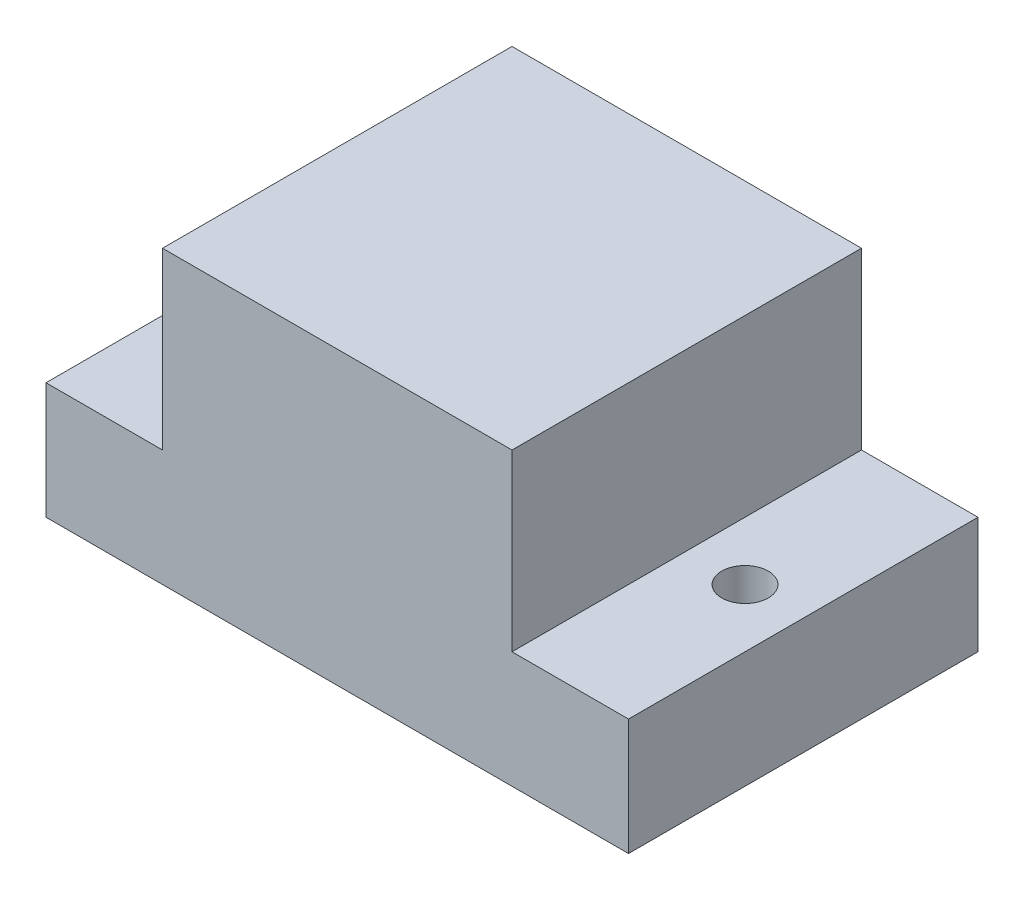
ISO-10303-21;
HEADER;
FILE_DESCRIPTION(('STEP AP214'),'2;1');
FILE_NAME('part.step','',(''),(''),'','','');
FILE_SCHEMA(('AUTOMOTIVE_DESIGN { 1 0 10303 214 1 1 1 1 }'));
ENDSEC;
DATA;
#1=APPLICATION_CONTEXT('core data for automotive mechanical design processes');
#2=APPLICATION_PROTOCOL_DEFINITION('international standard','automotive_design',2000,#1);
#3=PRODUCT_CONTEXT('',#1,'mechanical');
#4=PRODUCT('Part','Part','',(#3));
#5=PRODUCT_RELATED_PRODUCT_CATEGORY('part','',(#4));
#6=PRODUCT_DEFINITION_FORMATION('','',#4);
#7=PRODUCT_DEFINITION_CONTEXT('part definition',#1,'design');
#8=PRODUCT_DEFINITION('design','',#6,#7);
#9=PRODUCT_DEFINITION_SHAPE('','',#8);
#10=(LENGTH_UNIT() NAMED_UNIT(*) SI_UNIT(.MILLI.,.METRE.));
#11=(NAMED_UNIT(*) PLANE_ANGLE_UNIT() SI_UNIT($,.RADIAN.));
#12=(NAMED_UNIT(*) SI_UNIT($,.STERADIAN.) SOLID_ANGLE_UNIT());
#13=UNCERTAINTY_MEASURE_WITH_UNIT(LENGTH_MEASURE(1.E-05),#10,'distance_accuracy_value','');
#14=(GEOMETRIC_REPRESENTATION_CONTEXT(3) GLOBAL_UNCERTAINTY_ASSIGNED_CONTEXT((#13)) GLOBAL_UNIT_ASSIGNED_CONTEXT((#10,
#11,#12)) REPRESENTATION_CONTEXT('',''));
#15=CARTESIAN_POINT('',(0.,0.,0.));
#16=DIRECTION('',(0.,0.,1.));
#17=DIRECTION('',(1.,0.,0.));
#18=AXIS2_PLACEMENT_3D('',#15,#16,#17);
#19=CARTESIAN_POINT('',(-25.,0.,15.));
#20=DIRECTION('',(-1.,0.,0.));
#21=DIRECTION('',(0.,0.,1.));
#22=AXIS2_PLACEMENT_3D('',#19,#20,#21);
#23=PLANE('',#22);
#24=DIRECTION('',(0.,1.,0.));
#25=VECTOR('',#24,1.);
#26=CARTESIAN_POINT('',(-25.,0.,-15.));
#27=LINE('',#26,#25);
#28=CARTESIAN_POINT('',(-25.,-12.5,-15.));
#29=VERTEX_POINT('',#28);
#30=CARTESIAN_POINT('',(-25.,-2.5,-15.));
#31=VERTEX_POINT('',#30);
#32=EDGE_CURVE('E139',#29,#31,#27,.T.);
#33=ORIENTED_EDGE('',*,*,#32,.F.);
#34=DIRECTION('',(0.,0.,-1.));
#35=VECTOR('',#34,1.);
#36=CARTESIAN_POINT('',(-25.,-12.5,15.));
#37=LINE('',#36,#35);
#38=CARTESIAN_POINT('',(-25.,-12.5,15.));
#39=VERTEX_POINT('',#38);
#40=EDGE_CURVE('E11',#39,#29,#37,.T.);
#41=ORIENTED_EDGE('',*,*,#40,.F.);
#42=DIRECTION('',(0.,1.,0.));
#43=VECTOR('',#42,1.);
#44=CARTESIAN_POINT('',(-25.,0.,15.));
#45=LINE('',#44,#43);
#46=CARTESIAN_POINT('',(-25.,-2.5,15.));
#47=VERTEX_POINT('',#46);
#48=EDGE_CURVE('E168',#39,#47,#45,.T.);
#49=ORIENTED_EDGE('',*,*,#48,.T.);
#50=DIRECTION('',(0.,0.,-1.));
#51=VECTOR('',#50,1.);
#52=CARTESIAN_POINT('',(-25.,-2.5,15.));
#53=LINE('',#52,#51);
#54=EDGE_CURVE('E92',#47,#31,#53,.T.);
#55=ORIENTED_EDGE('',*,*,#54,.T.);
#56=EDGE_LOOP('',(#33,#41,#49,#55));
#57=FACE_BOUND('',#56,.T.);
#58=ADVANCED_FACE('F41',(#57),#23,.T.);
#59=CARTESIAN_POINT('',(0.,-12.5,15.));
#60=DIRECTION('',(0.,-1.,0.));
#61=DIRECTION('',(1.,0.,0.));
#62=AXIS2_PLACEMENT_3D('',#59,#60,#61);
#63=PLANE('',#62);
#64=CARTESIAN_POINT('',(-20.,-12.5,0.));
#65=DIRECTION('',(0.,-1.,0.));
#66=DIRECTION('',(1.,0.,0.));
#67=AXIS2_PLACEMENT_3D('',#64,#65,#66);
#68=CIRCLE('',#67,2.);
#69=CARTESIAN_POINT('',(-18.,-12.5,0.));
#70=VERTEX_POINT('',#69);
#71=EDGE_CURVE('E236',#70,#70,#68,.T.);
#72=ORIENTED_EDGE('',*,*,#71,.F.);
#73=EDGE_LOOP('',(#72));
#74=FACE_BOUND('',#73,.T.);
#75=CARTESIAN_POINT('',(20.,-12.5,0.));
#76=DIRECTION('',(0.,-1.,0.));
#77=DIRECTION('',(1.,0.,0.));
#78=AXIS2_PLACEMENT_3D('',#75,#76,#77);
#79=CIRCLE('',#78,2.);
#80=CARTESIAN_POINT('',(22.,-12.5,0.));
#81=VERTEX_POINT('',#80);
#82=EDGE_CURVE('E144',#81,#81,#79,.T.);
#83=ORIENTED_EDGE('',*,*,#82,.F.);
#84=EDGE_LOOP('',(#83));
#85=FACE_BOUND('',#84,.T.);
#86=DIRECTION('',(-1.,0.,0.));
#87=VECTOR('',#86,1.);
#88=CARTESIAN_POINT('',(0.,-12.5,-15.));
#89=LINE('',#88,#87);
#90=CARTESIAN_POINT('',(25.,-12.5,-15.));
#91=VERTEX_POINT('',#90);
#92=EDGE_CURVE('E143',#91,#29,#89,.T.);
#93=ORIENTED_EDGE('',*,*,#92,.F.);
#94=DIRECTION('',(0.,0.,-1.));
#95=VECTOR('',#94,1.);
#96=CARTESIAN_POINT('',(25.,-12.5,15.));
#97=LINE('',#96,#95);
#98=CARTESIAN_POINT('',(25.,-12.5,15.));
#99=VERTEX_POINT('',#98);
#100=EDGE_CURVE('E50',#99,#91,#97,.T.);
#101=ORIENTED_EDGE('',*,*,#100,.F.);
#102=DIRECTION('',(-1.,0.,0.));
#103=VECTOR('',#102,1.);
#104=CARTESIAN_POINT('',(0.,-12.5,15.));
#105=LINE('',#104,#103);
#106=EDGE_CURVE('E196',#99,#39,#105,.T.);
#107=ORIENTED_EDGE('',*,*,#106,.T.);
#108=ORIENTED_EDGE('',*,*,#40,.T.);
#109=EDGE_LOOP('',(#93,#101,#107,#108));
#110=FACE_BOUND('',#109,.T.);
#111=ADVANCED_FACE('F195',(#74,#85,#110),#63,.T.);
#112=CARTESIAN_POINT('',(25.,0.,15.));
#113=DIRECTION('',(-1.,0.,0.));
#114=DIRECTION('',(0.,0.,1.));
#115=AXIS2_PLACEMENT_3D('',#112,#113,#114);
#116=PLANE('',#115);
#117=DIRECTION('',(0.,1.,0.));
#118=VECTOR('',#117,1.);
#119=CARTESIAN_POINT('',(25.,0.,-15.));
#120=LINE('',#119,#118);
#121=CARTESIAN_POINT('',(25.,-2.5,-15.));
#122=VERTEX_POINT('',#121);
#123=EDGE_CURVE('E148',#91,#122,#120,.T.);
#124=ORIENTED_EDGE('',*,*,#123,.T.);
#125=DIRECTION('',(0.,0.,-1.));
#126=VECTOR('',#125,1.);
#127=CARTESIAN_POINT('',(25.,-2.5,15.));
#128=LINE('',#127,#126);
#129=CARTESIAN_POINT('',(25.,-2.5,15.));
#130=VERTEX_POINT('',#129);
#131=EDGE_CURVE('E178',#130,#122,#128,.T.);
#132=ORIENTED_EDGE('',*,*,#131,.F.);
#133=DIRECTION('',(0.,1.,0.));
#134=VECTOR('',#133,1.);
#135=CARTESIAN_POINT('',(25.,0.,15.));
#136=LINE('',#135,#134);
#137=EDGE_CURVE('E186',#99,#130,#136,.T.);
#138=ORIENTED_EDGE('',*,*,#137,.F.);
#139=ORIENTED_EDGE('',*,*,#100,.T.);
#140=EDGE_LOOP('',(#124,#132,#138,#139));
#141=FACE_BOUND('',#140,.T.);
#142=ADVANCED_FACE('F184',(#141),#116,.F.);
#143=CARTESIAN_POINT('',(0.,-2.5,15.));
#144=DIRECTION('',(0.,1.,0.));
#145=DIRECTION('',(-1.,0.,0.));
#146=AXIS2_PLACEMENT_3D('',#143,#144,#145);
#147=PLANE('',#146);
#148=CARTESIAN_POINT('',(20.,-2.5,0.));
#149=DIRECTION('',(0.,1.,0.));
#150=DIRECTION('',(1.,0.,0.));
#151=AXIS2_PLACEMENT_3D('',#148,#149,#150);
#152=CIRCLE('',#151,2.);
#153=CARTESIAN_POINT('',(22.,-2.5,0.));
#154=VERTEX_POINT('',#153);
#155=EDGE_CURVE('E246',#154,#154,#152,.T.);
#156=ORIENTED_EDGE('',*,*,#155,.F.);
#157=EDGE_LOOP('',(#156));
#158=FACE_BOUND('',#157,.T.);
#159=DIRECTION('',(1.,0.,0.));
#160=VECTOR('',#159,1.);
#161=CARTESIAN_POINT('',(0.,-2.5,-15.));
#162=LINE('',#161,#160);
#163=CARTESIAN_POINT('',(15.,-2.5,-15.));
#164=VERTEX_POINT('',#163);
#165=EDGE_CURVE('E152',#164,#122,#162,.T.);
#166=ORIENTED_EDGE('',*,*,#165,.F.);
#167=DIRECTION('',(0.,0.,-1.));
#168=VECTOR('',#167,1.);
#169=CARTESIAN_POINT('',(15.,-2.5,15.));
#170=LINE('',#169,#168);
#171=CARTESIAN_POINT('',(15.,-2.5,15.));
#172=VERTEX_POINT('',#171);
#173=EDGE_CURVE('E175',#172,#164,#170,.T.);
#174=ORIENTED_EDGE('',*,*,#173,.F.);
#175=DIRECTION('',(1.,0.,0.));
#176=VECTOR('',#175,1.);
#177=CARTESIAN_POINT('',(0.,-2.5,15.));
#178=LINE('',#177,#176);
#179=EDGE_CURVE('E207',#172,#130,#178,.T.);
#180=ORIENTED_EDGE('',*,*,#179,.T.);
#181=ORIENTED_EDGE('',*,*,#131,.T.);
#182=EDGE_LOOP('',(#166,#174,#180,#181));
#183=FACE_BOUND('',#182,.T.);
#184=ADVANCED_FACE('F212',(#158,#183),#147,.T.);
#185=CARTESIAN_POINT('',(15.,0.,15.));
#186=DIRECTION('',(-1.,0.,0.));
#187=DIRECTION('',(0.,0.,1.));
#188=AXIS2_PLACEMENT_3D('',#185,#186,#187);
#189=PLANE('',#188);
#190=DIRECTION('',(0.,1.,0.));
#191=VECTOR('',#190,1.);
#192=CARTESIAN_POINT('',(15.,0.,-15.));
#193=LINE('',#192,#191);
#194=CARTESIAN_POINT('',(15.,12.5,-15.));
#195=VERTEX_POINT('',#194);
#196=EDGE_CURVE('E156',#164,#195,#193,.T.);
#197=ORIENTED_EDGE('',*,*,#196,.T.);
#198=DIRECTION('',(0.,0.,-1.));
#199=VECTOR('',#198,1.);
#200=CARTESIAN_POINT('',(15.,12.5,15.));
#201=LINE('',#200,#199);
#202=CARTESIAN_POINT('',(15.,12.5,15.));
#203=VERTEX_POINT('',#202);
#204=EDGE_CURVE('E122',#203,#195,#201,.T.);
#205=ORIENTED_EDGE('',*,*,#204,.F.);
#206=DIRECTION('',(0.,1.,0.));
#207=VECTOR('',#206,1.);
#208=CARTESIAN_POINT('',(15.,0.,15.));
#209=LINE('',#208,#207);
#210=EDGE_CURVE('E128',#172,#203,#209,.T.);
#211=ORIENTED_EDGE('',*,*,#210,.F.);
#212=ORIENTED_EDGE('',*,*,#173,.T.);
#213=EDGE_LOOP('',(#197,#205,#211,#212));
#214=FACE_BOUND('',#213,.T.);
#215=ADVANCED_FACE('F214',(#214),#189,.F.);
#216=CARTESIAN_POINT('',(0.,12.5,15.));
#217=DIRECTION('',(0.,1.,0.));
#218=DIRECTION('',(0.,0.,1.));
#219=AXIS2_PLACEMENT_3D('',#216,#217,#218);
#220=PLANE('',#219);
#221=DIRECTION('',(1.,0.,0.));
#222=VECTOR('',#221,1.);
#223=CARTESIAN_POINT('',(0.,12.5,-15.));
#224=LINE('',#223,#222);
#225=CARTESIAN_POINT('',(-15.,12.5,-15.));
#226=VERTEX_POINT('',#225);
#227=EDGE_CURVE('E116',#226,#195,#224,.T.);
#228=ORIENTED_EDGE('',*,*,#227,.F.);
#229=DIRECTION('',(0.,0.,-1.));
#230=VECTOR('',#229,1.);
#231=CARTESIAN_POINT('',(-15.,12.5,15.));
#232=LINE('',#231,#230);
#233=CARTESIAN_POINT('',(-15.,12.5,15.));
#234=VERTEX_POINT('',#233);
#235=EDGE_CURVE('E111',#234,#226,#232,.T.);
#236=ORIENTED_EDGE('',*,*,#235,.F.);
#237=DIRECTION('',(1.,0.,0.));
#238=VECTOR('',#237,1.);
#239=CARTESIAN_POINT('',(0.,12.5,15.));
#240=LINE('',#239,#238);
#241=EDGE_CURVE('E114',#234,#203,#240,.T.);
#242=ORIENTED_EDGE('',*,*,#241,.T.);
#243=ORIENTED_EDGE('',*,*,#204,.T.);
#244=EDGE_LOOP('',(#228,#236,#242,#243));
#245=FACE_BOUND('',#244,.T.);
#246=ADVANCED_FACE('F113',(#245),#220,.T.);
#247=CARTESIAN_POINT('',(-15.,0.,15.));
#248=DIRECTION('',(-1.,0.,0.));
#249=DIRECTION('',(0.,0.,1.));
#250=AXIS2_PLACEMENT_3D('',#247,#248,#249);
#251=PLANE('',#250);
#252=DIRECTION('',(0.,1.,0.));
#253=VECTOR('',#252,1.);
#254=CARTESIAN_POINT('',(-15.,0.,-15.));
#255=LINE('',#254,#253);
#256=CARTESIAN_POINT('',(-15.,-2.5,-15.));
#257=VERTEX_POINT('',#256);
#258=EDGE_CURVE('E162',#257,#226,#255,.T.);
#259=ORIENTED_EDGE('',*,*,#258,.F.);
#260=DIRECTION('',(0.,0.,-1.));
#261=VECTOR('',#260,1.);
#262=CARTESIAN_POINT('',(-15.,-2.5,15.));
#263=LINE('',#262,#261);
#264=CARTESIAN_POINT('',(-15.,-2.5,15.));
#265=VERTEX_POINT('',#264);
#266=EDGE_CURVE('E85',#265,#257,#263,.T.);
#267=ORIENTED_EDGE('',*,*,#266,.F.);
#268=DIRECTION('',(0.,1.,0.));
#269=VECTOR('',#268,1.);
#270=CARTESIAN_POINT('',(-15.,0.,15.));
#271=LINE('',#270,#269);
#272=EDGE_CURVE('E125',#265,#234,#271,.T.);
#273=ORIENTED_EDGE('',*,*,#272,.T.);
#274=ORIENTED_EDGE('',*,*,#235,.T.);
#275=EDGE_LOOP('',(#259,#267,#273,#274));
#276=FACE_BOUND('',#275,.T.);
#277=ADVANCED_FACE('F132',(#276),#251,.T.);
#278=CARTESIAN_POINT('',(0.,-2.5,15.));
#279=DIRECTION('',(0.,-1.,0.));
#280=DIRECTION('',(1.,0.,0.));
#281=AXIS2_PLACEMENT_3D('',#278,#279,#280);
#282=PLANE('',#281);
#283=CARTESIAN_POINT('',(-20.,-2.5,0.));
#284=DIRECTION('',(0.,1.,0.));
#285=DIRECTION('',(-1.,0.,0.));
#286=AXIS2_PLACEMENT_3D('',#283,#284,#285);
#287=CIRCLE('',#286,2.);
#288=CARTESIAN_POINT('',(-22.,-2.5,0.));
#289=VERTEX_POINT('',#288);
#290=EDGE_CURVE('E242',#289,#289,#287,.T.);
#291=ORIENTED_EDGE('',*,*,#290,.F.);
#292=EDGE_LOOP('',(#291));
#293=FACE_BOUND('',#292,.T.);
#294=DIRECTION('',(-1.,0.,0.));
#295=VECTOR('',#294,1.);
#296=CARTESIAN_POINT('',(0.,-2.5,-15.));
#297=LINE('',#296,#295);
#298=EDGE_CURVE('E165',#257,#31,#297,.T.);
#299=ORIENTED_EDGE('',*,*,#298,.T.);
#300=ORIENTED_EDGE('',*,*,#54,.F.);
#301=DIRECTION('',(-1.,0.,0.));
#302=VECTOR('',#301,1.);
#303=CARTESIAN_POINT('',(0.,-2.5,15.));
#304=LINE('',#303,#302);
#305=EDGE_CURVE('E58',#265,#47,#304,.T.);
#306=ORIENTED_EDGE('',*,*,#305,.F.);
#307=ORIENTED_EDGE('',*,*,#266,.T.);
#308=EDGE_LOOP('',(#299,#300,#306,#307));
#309=FACE_BOUND('',#308,.T.);
#310=ADVANCED_FACE('F197',(#293,#309),#282,.F.);
#311=CARTESIAN_POINT('',(0.,0.,15.));
#312=DIRECTION('',(0.,0.,1.));
#313=DIRECTION('',(1.,0.,0.));
#314=AXIS2_PLACEMENT_3D('',#311,#312,#313);
#315=PLANE('',#314);
#316=ORIENTED_EDGE('',*,*,#48,.F.);
#317=ORIENTED_EDGE('',*,*,#106,.F.);
#318=ORIENTED_EDGE('',*,*,#137,.T.);
#319=ORIENTED_EDGE('',*,*,#179,.F.);
#320=ORIENTED_EDGE('',*,*,#210,.T.);
#321=ORIENTED_EDGE('',*,*,#241,.F.);
#322=ORIENTED_EDGE('',*,*,#272,.F.);
#323=ORIENTED_EDGE('',*,*,#305,.T.);
#324=EDGE_LOOP('',(#316,#317,#318,#319,#320,#321,#322,#323));
#325=FACE_BOUND('',#324,.T.);
#326=ADVANCED_FACE('F124',(#325),#315,.T.);
#327=CARTESIAN_POINT('',(0.,0.,-15.));
#328=DIRECTION('',(0.,0.,1.));
#329=DIRECTION('',(1.,0.,0.));
#330=AXIS2_PLACEMENT_3D('',#327,#328,#329);
#331=PLANE('',#330);
#332=ORIENTED_EDGE('',*,*,#32,.T.);
#333=ORIENTED_EDGE('',*,*,#298,.F.);
#334=ORIENTED_EDGE('',*,*,#258,.T.);
#335=ORIENTED_EDGE('',*,*,#227,.T.);
#336=ORIENTED_EDGE('',*,*,#196,.F.);
#337=ORIENTED_EDGE('',*,*,#165,.T.);
#338=ORIENTED_EDGE('',*,*,#123,.F.);
#339=ORIENTED_EDGE('',*,*,#92,.T.);
#340=EDGE_LOOP('',(#332,#333,#334,#335,#336,#337,#338,#339));
#341=FACE_BOUND('',#340,.T.);
#342=ADVANCED_FACE('F192',(#341),#331,.F.);
#343=CARTESIAN_POINT('',(-20.,-32.5,0.));
#344=DIRECTION('',(0.,1.,0.));
#345=DIRECTION('',(-1.,0.,0.));
#346=AXIS2_PLACEMENT_3D('',#343,#344,#345);
#347=CYLINDRICAL_SURFACE('',#346,2.);
#348=ORIENTED_EDGE('',*,*,#71,.T.);
#349=EDGE_LOOP('',(#348));
#350=FACE_BOUND('',#349,.T.);
#351=ORIENTED_EDGE('',*,*,#290,.T.);
#352=EDGE_LOOP('',(#351));
#353=FACE_BOUND('',#352,.T.);
#354=ADVANCED_FACE('F255',(#350,#353),#347,.F.);
#355=CARTESIAN_POINT('',(20.,-32.5,0.));
#356=DIRECTION('',(0.,1.,0.));
#357=DIRECTION('',(-1.,0.,0.));
#358=AXIS2_PLACEMENT_3D('',#355,#356,#357);
#359=CYLINDRICAL_SURFACE('',#358,2.);
#360=ORIENTED_EDGE('',*,*,#82,.T.);
#361=EDGE_LOOP('',(#360));
#362=FACE_BOUND('',#361,.T.);
#363=ORIENTED_EDGE('',*,*,#155,.T.);
#364=EDGE_LOOP('',(#363));
#365=FACE_BOUND('',#364,.T.);
#366=ADVANCED_FACE('F253',(#362,#365),#359,.F.);
#367=CLOSED_SHELL('',(#58,#111,#142,#184,#215,#246,#277,#310,#326,#342,#354,#366));
#368=MANIFOLD_SOLID_BREP('B2',#367);
#369=ADVANCED_BREP_SHAPE_REPRESENTATION('',(#18,#368),#14);
#370=SHAPE_DEFINITION_REPRESENTATION(#9,#369);
ENDSEC;
END-ISO-10303-21;
